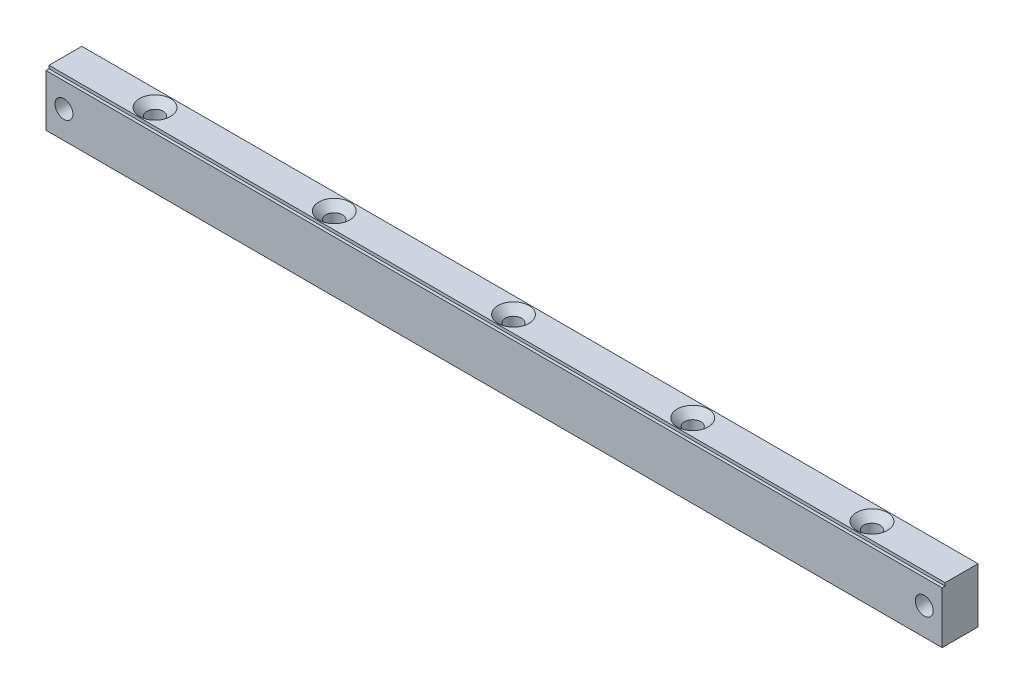
ISO-10303-21;
HEADER;
FILE_DESCRIPTION(('STEP AP214'),'2;1');
FILE_NAME('part.step','',(''),(''),'','','');
FILE_SCHEMA(('AUTOMOTIVE_DESIGN { 1 0 10303 214 1 1 1 1 }'));
ENDSEC;
DATA;
#1=APPLICATION_CONTEXT('core data for automotive mechanical design processes');
#2=APPLICATION_PROTOCOL_DEFINITION('international standard','automotive_design',2000,#1);
#3=PRODUCT_CONTEXT('',#1,'mechanical');
#4=PRODUCT('Part','Part','',(#3));
#5=PRODUCT_RELATED_PRODUCT_CATEGORY('part','',(#4));
#6=PRODUCT_DEFINITION_FORMATION('','',#4);
#7=PRODUCT_DEFINITION_CONTEXT('part definition',#1,'design');
#8=PRODUCT_DEFINITION('design','',#6,#7);
#9=PRODUCT_DEFINITION_SHAPE('','',#8);
#10=(LENGTH_UNIT() NAMED_UNIT(*) SI_UNIT(.MILLI.,.METRE.));
#11=(NAMED_UNIT(*) PLANE_ANGLE_UNIT() SI_UNIT($,.RADIAN.));
#12=(NAMED_UNIT(*) SI_UNIT($,.STERADIAN.) SOLID_ANGLE_UNIT());
#13=UNCERTAINTY_MEASURE_WITH_UNIT(LENGTH_MEASURE(1.E-05),#10,'distance_accuracy_value','');
#14=(GEOMETRIC_REPRESENTATION_CONTEXT(3) GLOBAL_UNCERTAINTY_ASSIGNED_CONTEXT((#13)) GLOBAL_UNIT_ASSIGNED_CONTEXT((#10,
#11,#12)) REPRESENTATION_CONTEXT('',''));
#15=CARTESIAN_POINT('',(0.,0.,0.));
#16=DIRECTION('',(0.,0.,1.));
#17=DIRECTION('',(1.,0.,0.));
#18=AXIS2_PLACEMENT_3D('',#15,#16,#17);
#19=CARTESIAN_POINT('',(-150.,18.35,-12.));
#20=DIRECTION('',(1.,0.,0.));
#21=DIRECTION('',(0.,0.,-1.));
#22=AXIS2_PLACEMENT_3D('',#19,#20,#21);
#23=PLANE('',#22);
#24=DIRECTION('',(0.,0.,1.));
#25=VECTOR('',#24,1.);
#26=CARTESIAN_POINT('',(-150.,17.35,0.));
#27=LINE('',#26,#25);
#28=CARTESIAN_POINT('',(-150.,17.35,-1.00000000000003));
#29=VERTEX_POINT('',#28);
#30=CARTESIAN_POINT('',(-150.,17.35,0.));
#31=VERTEX_POINT('',#30);
#32=EDGE_CURVE('E138',#29,#31,#27,.T.);
#33=ORIENTED_EDGE('',*,*,#32,.F.);
#34=DIRECTION('',(0.,1.,0.));
#35=VECTOR('',#34,1.);
#36=CARTESIAN_POINT('',(-150.,17.35,-1.00000000000003));
#37=LINE('',#36,#35);
#38=CARTESIAN_POINT('',(-150.,18.35,-1.00000000000003));
#39=VERTEX_POINT('',#38);
#40=EDGE_CURVE('E110',#29,#39,#37,.T.);
#41=ORIENTED_EDGE('',*,*,#40,.T.);
#42=DIRECTION('',(0.,0.,1.));
#43=VECTOR('',#42,1.);
#44=CARTESIAN_POINT('',(-150.,18.35,-12.));
#45=LINE('',#44,#43);
#46=CARTESIAN_POINT('',(-150.,18.35,-12.));
#47=VERTEX_POINT('',#46);
#48=EDGE_CURVE('E94',#47,#39,#45,.T.);
#49=ORIENTED_EDGE('',*,*,#48,.F.);
#50=DIRECTION('',(0.,-1.,0.));
#51=VECTOR('',#50,1.);
#52=CARTESIAN_POINT('',(-150.,18.35,-12.));
#53=LINE('',#52,#51);
#54=CARTESIAN_POINT('',(-150.,0.,-12.));
#55=VERTEX_POINT('',#54);
#56=EDGE_CURVE('E86',#47,#55,#53,.T.);
#57=ORIENTED_EDGE('',*,*,#56,.T.);
#58=DIRECTION('',(0.,0.,1.));
#59=VECTOR('',#58,1.);
#60=CARTESIAN_POINT('',(-150.,0.,-12.));
#61=LINE('',#60,#59);
#62=CARTESIAN_POINT('',(-150.,0.,0.));
#63=VERTEX_POINT('',#62);
#64=EDGE_CURVE('E101',#55,#63,#61,.T.);
#65=ORIENTED_EDGE('',*,*,#64,.T.);
#66=DIRECTION('',(0.,-1.,0.));
#67=VECTOR('',#66,1.);
#68=CARTESIAN_POINT('',(-150.,18.35,0.));
#69=LINE('',#68,#67);
#70=EDGE_CURVE('E11',#31,#63,#69,.T.);
#71=ORIENTED_EDGE('',*,*,#70,.F.);
#72=EDGE_LOOP('',(#33,#41,#49,#57,#65,#71));
#73=FACE_BOUND('',#72,.T.);
#74=ADVANCED_FACE('F41',(#73),#23,.F.);
#75=CARTESIAN_POINT('',(-150.,18.35,0.));
#76=DIRECTION('',(0.,0.,-1.));
#77=DIRECTION('',(-1.,0.,0.));
#78=AXIS2_PLACEMENT_3D('',#75,#76,#77);
#79=PLANE('',#78);
#80=CARTESIAN_POINT('',(-144.,9.175,0.));
#81=DIRECTION('',(0.,0.,1.));
#82=DIRECTION('',(1.,0.,0.));
#83=AXIS2_PLACEMENT_3D('',#80,#81,#82);
#84=CIRCLE('',#83,2.99999999999999);
#85=CARTESIAN_POINT('',(-141.,9.175,0.));
#86=VERTEX_POINT('',#85);
#87=EDGE_CURVE('E194',#86,#86,#84,.T.);
#88=ORIENTED_EDGE('',*,*,#87,.F.);
#89=EDGE_LOOP('',(#88));
#90=FACE_BOUND('',#89,.T.);
#91=CARTESIAN_POINT('',(144.,9.17500000000004,0.));
#92=DIRECTION('',(0.,0.,1.));
#93=DIRECTION('',(1.,0.,0.));
#94=AXIS2_PLACEMENT_3D('',#91,#92,#93);
#95=CIRCLE('',#94,2.99999999999999);
#96=CARTESIAN_POINT('',(147.,9.17500000000004,0.));
#97=VERTEX_POINT('',#96);
#98=EDGE_CURVE('E197',#97,#97,#95,.T.);
#99=ORIENTED_EDGE('',*,*,#98,.F.);
#100=EDGE_LOOP('',(#99));
#101=FACE_BOUND('',#100,.T.);
#102=DIRECTION('',(0.,-1.,0.));
#103=VECTOR('',#102,1.);
#104=CARTESIAN_POINT('',(150.,18.35,0.));
#105=LINE('',#104,#103);
#106=CARTESIAN_POINT('',(150.,17.35,0.));
#107=VERTEX_POINT('',#106);
#108=CARTESIAN_POINT('',(150.,0.,0.));
#109=VERTEX_POINT('',#108);
#110=EDGE_CURVE('E49',#107,#109,#105,.T.);
#111=ORIENTED_EDGE('',*,*,#110,.F.);
#112=DIRECTION('',(1.,0.,0.));
#113=VECTOR('',#112,1.);
#114=CARTESIAN_POINT('',(-150.,17.35,0.));
#115=LINE('',#114,#113);
#116=EDGE_CURVE('E136',#31,#107,#115,.T.);
#117=ORIENTED_EDGE('',*,*,#116,.F.);
#118=ORIENTED_EDGE('',*,*,#70,.T.);
#119=DIRECTION('',(1.,0.,0.));
#120=VECTOR('',#119,1.);
#121=CARTESIAN_POINT('',(-150.,0.,0.));
#122=LINE('',#121,#120);
#123=EDGE_CURVE('E108',#63,#109,#122,.T.);
#124=ORIENTED_EDGE('',*,*,#123,.T.);
#125=EDGE_LOOP('',(#111,#117,#118,#124));
#126=FACE_BOUND('',#125,.T.);
#127=ADVANCED_FACE('F133',(#90,#101,#126),#79,.F.);
#128=CARTESIAN_POINT('',(150.,18.35,-12.0000000000001));
#129=DIRECTION('',(-1.,0.,0.));
#130=DIRECTION('',(0.,0.,1.));
#131=AXIS2_PLACEMENT_3D('',#128,#129,#130);
#132=PLANE('',#131);
#133=DIRECTION('',(0.,0.,-1.));
#134=VECTOR('',#133,1.);
#135=CARTESIAN_POINT('',(150.,18.35,-12.0000000000001));
#136=LINE('',#135,#134);
#137=CARTESIAN_POINT('',(150.,18.35,-1.00000000000003));
#138=VERTEX_POINT('',#137);
#139=CARTESIAN_POINT('',(150.,18.35,-12.0000000000001));
#140=VERTEX_POINT('',#139);
#141=EDGE_CURVE('E164',#138,#140,#136,.T.);
#142=ORIENTED_EDGE('',*,*,#141,.F.);
#143=DIRECTION('',(0.,1.,0.));
#144=VECTOR('',#143,1.);
#145=CARTESIAN_POINT('',(150.,17.35,-1.00000000000003));
#146=LINE('',#145,#144);
#147=CARTESIAN_POINT('',(150.,17.35,-1.00000000000003));
#148=VERTEX_POINT('',#147);
#149=EDGE_CURVE('E56',#148,#138,#146,.T.);
#150=ORIENTED_EDGE('',*,*,#149,.F.);
#151=DIRECTION('',(0.,0.,-1.));
#152=VECTOR('',#151,1.);
#153=CARTESIAN_POINT('',(150.,17.35,0.));
#154=LINE('',#153,#152);
#155=EDGE_CURVE('E130',#107,#148,#154,.T.);
#156=ORIENTED_EDGE('',*,*,#155,.F.);
#157=ORIENTED_EDGE('',*,*,#110,.T.);
#158=DIRECTION('',(0.,0.,-1.));
#159=VECTOR('',#158,1.);
#160=CARTESIAN_POINT('',(150.,0.,-12.0000000000001));
#161=LINE('',#160,#159);
#162=CARTESIAN_POINT('',(150.,0.,-12.0000000000001));
#163=VERTEX_POINT('',#162);
#164=EDGE_CURVE('E95',#109,#163,#161,.T.);
#165=ORIENTED_EDGE('',*,*,#164,.T.);
#166=DIRECTION('',(0.,-1.,0.));
#167=VECTOR('',#166,1.);
#168=CARTESIAN_POINT('',(150.,18.35,-12.0000000000001));
#169=LINE('',#168,#167);
#170=EDGE_CURVE('E89',#140,#163,#169,.T.);
#171=ORIENTED_EDGE('',*,*,#170,.F.);
#172=EDGE_LOOP('',(#142,#150,#156,#157,#165,#171));
#173=FACE_BOUND('',#172,.T.);
#174=ADVANCED_FACE('F127',(#173),#132,.F.);
#175=CARTESIAN_POINT('',(-150.,18.35,-12.));
#176=DIRECTION('',(0.,0.,1.));
#177=DIRECTION('',(1.,0.,0.));
#178=AXIS2_PLACEMENT_3D('',#175,#176,#177);
#179=PLANE('',#178);
#180=CARTESIAN_POINT('',(-144.,9.175,-12.));
#181=DIRECTION('',(0.,0.,1.));
#182=DIRECTION('',(1.,0.,0.));
#183=AXIS2_PLACEMENT_3D('',#180,#181,#182);
#184=CIRCLE('',#183,2.99999999999999);
#185=CARTESIAN_POINT('',(-141.,9.175,-12.));
#186=VERTEX_POINT('',#185);
#187=EDGE_CURVE('E200',#186,#186,#184,.T.);
#188=ORIENTED_EDGE('',*,*,#187,.T.);
#189=EDGE_LOOP('',(#188));
#190=FACE_BOUND('',#189,.T.);
#191=CARTESIAN_POINT('',(144.,9.17500000000004,-12.));
#192=DIRECTION('',(0.,0.,1.));
#193=DIRECTION('',(1.,0.,0.));
#194=AXIS2_PLACEMENT_3D('',#191,#192,#193);
#195=CIRCLE('',#194,2.99999999999999);
#196=CARTESIAN_POINT('',(147.,9.17500000000004,-12.));
#197=VERTEX_POINT('',#196);
#198=EDGE_CURVE('E201',#197,#197,#195,.T.);
#199=ORIENTED_EDGE('',*,*,#198,.T.);
#200=EDGE_LOOP('',(#199));
#201=FACE_BOUND('',#200,.T.);
#202=DIRECTION('',(-1.,0.,0.));
#203=VECTOR('',#202,1.);
#204=CARTESIAN_POINT('',(-150.,0.,-12.));
#205=LINE('',#204,#203);
#206=EDGE_CURVE('E83',#163,#55,#205,.T.);
#207=ORIENTED_EDGE('',*,*,#206,.T.);
#208=ORIENTED_EDGE('',*,*,#56,.F.);
#209=DIRECTION('',(-1.,0.,0.));
#210=VECTOR('',#209,1.);
#211=CARTESIAN_POINT('',(-150.,18.35,-12.));
#212=LINE('',#211,#210);
#213=EDGE_CURVE('E65',#140,#47,#212,.T.);
#214=ORIENTED_EDGE('',*,*,#213,.F.);
#215=ORIENTED_EDGE('',*,*,#170,.T.);
#216=EDGE_LOOP('',(#207,#208,#214,#215));
#217=FACE_BOUND('',#216,.T.);
#218=ADVANCED_FACE('F85',(#190,#201,#217),#179,.F.);
#219=CARTESIAN_POINT('',(0.,18.35,0.));
#220=DIRECTION('',(0.,1.,0.));
#221=DIRECTION('',(0.,0.,1.));
#222=AXIS2_PLACEMENT_3D('',#219,#220,#221);
#223=PLANE('',#222);
#224=CARTESIAN_POINT('',(-120.,18.35,-6.50000000000005));
#225=DIRECTION('',(0.,1.,0.));
#226=DIRECTION('',(0.,0.,1.));
#227=AXIS2_PLACEMENT_3D('',#224,#225,#226);
#228=CIRCLE('',#227,5.2);
#229=CARTESIAN_POINT('',(-120.,18.35,-1.30000000000006));
#230=VERTEX_POINT('',#229);
#231=EDGE_CURVE('E211',#230,#230,#228,.T.);
#232=ORIENTED_EDGE('',*,*,#231,.F.);
#233=EDGE_LOOP('',(#232));
#234=FACE_BOUND('',#233,.T.);
#235=CARTESIAN_POINT('',(-60.,18.35,-6.50000000000005));
#236=DIRECTION('',(0.,1.,0.));
#237=DIRECTION('',(0.,0.,1.));
#238=AXIS2_PLACEMENT_3D('',#235,#236,#237);
#239=CIRCLE('',#238,5.2);
#240=CARTESIAN_POINT('',(-60.,18.35,-1.30000000000005));
#241=VERTEX_POINT('',#240);
#242=EDGE_CURVE('E223',#241,#241,#239,.T.);
#243=ORIENTED_EDGE('',*,*,#242,.F.);
#244=EDGE_LOOP('',(#243));
#245=FACE_BOUND('',#244,.T.);
#246=CARTESIAN_POINT('',(120.,18.35,-6.50000000000006));
#247=DIRECTION('',(0.,1.,0.));
#248=DIRECTION('',(0.,0.,1.));
#249=AXIS2_PLACEMENT_3D('',#246,#247,#248);
#250=CIRCLE('',#249,5.2);
#251=CARTESIAN_POINT('',(120.,18.35,-1.30000000000006));
#252=VERTEX_POINT('',#251);
#253=EDGE_CURVE('E235',#252,#252,#250,.T.);
#254=ORIENTED_EDGE('',*,*,#253,.F.);
#255=EDGE_LOOP('',(#254));
#256=FACE_BOUND('',#255,.T.);
#257=CARTESIAN_POINT('',(60.,18.35,-6.50000000000006));
#258=DIRECTION('',(0.,1.,0.));
#259=DIRECTION('',(0.,0.,1.));
#260=AXIS2_PLACEMENT_3D('',#257,#258,#259);
#261=CIRCLE('',#260,5.2);
#262=CARTESIAN_POINT('',(60.,18.35,-1.30000000000005));
#263=VERTEX_POINT('',#262);
#264=EDGE_CURVE('E247',#263,#263,#261,.T.);
#265=ORIENTED_EDGE('',*,*,#264,.F.);
#266=EDGE_LOOP('',(#265));
#267=FACE_BOUND('',#266,.T.);
#268=CARTESIAN_POINT('',(0.,18.35,-6.50000000000006));
#269=DIRECTION('',(0.,1.,0.));
#270=DIRECTION('',(0.,0.,1.));
#271=AXIS2_PLACEMENT_3D('',#268,#269,#270);
#272=CIRCLE('',#271,5.2);
#273=CARTESIAN_POINT('',(0.,18.35,-1.30000000000005));
#274=VERTEX_POINT('',#273);
#275=EDGE_CURVE('E259',#274,#274,#272,.T.);
#276=ORIENTED_EDGE('',*,*,#275,.F.);
#277=EDGE_LOOP('',(#276));
#278=FACE_BOUND('',#277,.T.);
#279=DIRECTION('',(-1.,0.,0.));
#280=VECTOR('',#279,1.);
#281=CARTESIAN_POINT('',(-150.,18.35,-1.00000000000003));
#282=LINE('',#281,#280);
#283=EDGE_CURVE('E150',#138,#39,#282,.T.);
#284=ORIENTED_EDGE('',*,*,#283,.F.);
#285=ORIENTED_EDGE('',*,*,#141,.T.);
#286=ORIENTED_EDGE('',*,*,#213,.T.);
#287=ORIENTED_EDGE('',*,*,#48,.T.);
#288=EDGE_LOOP('',(#284,#285,#286,#287));
#289=FACE_BOUND('',#288,.T.);
#290=ADVANCED_FACE('F167',(#234,#245,#256,#267,#278,#289),#223,.T.);
#291=CARTESIAN_POINT('',(0.,0.,0.));
#292=DIRECTION('',(0.,1.,0.));
#293=DIRECTION('',(0.,0.,1.));
#294=AXIS2_PLACEMENT_3D('',#291,#292,#293);
#295=PLANE('',#294);
#296=CARTESIAN_POINT('',(-120.,0.,-6.50000000000005));
#297=DIRECTION('',(0.,1.,0.));
#298=DIRECTION('',(0.,0.,1.));
#299=AXIS2_PLACEMENT_3D('',#296,#297,#298);
#300=CIRCLE('',#299,2.74999999999999);
#301=CARTESIAN_POINT('',(-120.,0.,-3.75000000000007));
#302=VERTEX_POINT('',#301);
#303=EDGE_CURVE('E219',#302,#302,#300,.T.);
#304=ORIENTED_EDGE('',*,*,#303,.T.);
#305=EDGE_LOOP('',(#304));
#306=FACE_BOUND('',#305,.T.);
#307=CARTESIAN_POINT('',(-60.,0.,-6.50000000000005));
#308=DIRECTION('',(0.,1.,0.));
#309=DIRECTION('',(0.,0.,1.));
#310=AXIS2_PLACEMENT_3D('',#307,#308,#309);
#311=CIRCLE('',#310,2.75);
#312=CARTESIAN_POINT('',(-60.,0.,-3.75000000000006));
#313=VERTEX_POINT('',#312);
#314=EDGE_CURVE('E231',#313,#313,#311,.T.);
#315=ORIENTED_EDGE('',*,*,#314,.T.);
#316=EDGE_LOOP('',(#315));
#317=FACE_BOUND('',#316,.T.);
#318=CARTESIAN_POINT('',(120.,0.,-6.50000000000006));
#319=DIRECTION('',(0.,1.,0.));
#320=DIRECTION('',(0.,0.,1.));
#321=AXIS2_PLACEMENT_3D('',#318,#319,#320);
#322=CIRCLE('',#321,2.74999999999999);
#323=CARTESIAN_POINT('',(120.,0.,-3.75000000000007));
#324=VERTEX_POINT('',#323);
#325=EDGE_CURVE('E243',#324,#324,#322,.T.);
#326=ORIENTED_EDGE('',*,*,#325,.T.);
#327=EDGE_LOOP('',(#326));
#328=FACE_BOUND('',#327,.T.);
#329=CARTESIAN_POINT('',(60.,0.,-6.50000000000006));
#330=DIRECTION('',(0.,1.,0.));
#331=DIRECTION('',(0.,0.,1.));
#332=AXIS2_PLACEMENT_3D('',#329,#330,#331);
#333=CIRCLE('',#332,2.75);
#334=CARTESIAN_POINT('',(60.,0.,-3.75000000000006));
#335=VERTEX_POINT('',#334);
#336=EDGE_CURVE('E255',#335,#335,#333,.T.);
#337=ORIENTED_EDGE('',*,*,#336,.T.);
#338=EDGE_LOOP('',(#337));
#339=FACE_BOUND('',#338,.T.);
#340=CARTESIAN_POINT('',(0.,0.,-6.50000000000006));
#341=DIRECTION('',(0.,1.,0.));
#342=DIRECTION('',(0.,0.,1.));
#343=AXIS2_PLACEMENT_3D('',#340,#341,#342);
#344=CIRCLE('',#343,2.75);
#345=CARTESIAN_POINT('',(0.,0.,-3.75000000000006));
#346=VERTEX_POINT('',#345);
#347=EDGE_CURVE('E161',#346,#346,#344,.T.);
#348=ORIENTED_EDGE('',*,*,#347,.T.);
#349=EDGE_LOOP('',(#348));
#350=FACE_BOUND('',#349,.T.);
#351=ORIENTED_EDGE('',*,*,#64,.F.);
#352=ORIENTED_EDGE('',*,*,#206,.F.);
#353=ORIENTED_EDGE('',*,*,#164,.F.);
#354=ORIENTED_EDGE('',*,*,#123,.F.);
#355=EDGE_LOOP('',(#351,#352,#353,#354));
#356=FACE_BOUND('',#355,.T.);
#357=ADVANCED_FACE('F106',(#306,#317,#328,#339,#350,#356),#295,.F.);
#358=CARTESIAN_POINT('',(-150.,17.35,-1.00000000000003));
#359=DIRECTION('',(0.,0.,-1.));
#360=DIRECTION('',(-1.,0.,0.));
#361=AXIS2_PLACEMENT_3D('',#358,#359,#360);
#362=PLANE('',#361);
#363=ORIENTED_EDGE('',*,*,#283,.T.);
#364=ORIENTED_EDGE('',*,*,#40,.F.);
#365=DIRECTION('',(-1.,0.,0.));
#366=VECTOR('',#365,1.);
#367=CARTESIAN_POINT('',(-150.,17.35,-1.00000000000003));
#368=LINE('',#367,#366);
#369=EDGE_CURVE('E149',#148,#29,#368,.T.);
#370=ORIENTED_EDGE('',*,*,#369,.F.);
#371=ORIENTED_EDGE('',*,*,#149,.T.);
#372=EDGE_LOOP('',(#363,#364,#370,#371));
#373=FACE_BOUND('',#372,.T.);
#374=ADVANCED_FACE('F148',(#373),#362,.F.);
#375=CARTESIAN_POINT('',(0.,17.35,0.));
#376=DIRECTION('',(0.,-1.,0.));
#377=DIRECTION('',(0.,0.,-1.));
#378=AXIS2_PLACEMENT_3D('',#375,#376,#377);
#379=PLANE('',#378);
#380=ORIENTED_EDGE('',*,*,#32,.T.);
#381=ORIENTED_EDGE('',*,*,#116,.T.);
#382=ORIENTED_EDGE('',*,*,#155,.T.);
#383=ORIENTED_EDGE('',*,*,#369,.T.);
#384=EDGE_LOOP('',(#380,#381,#382,#383));
#385=FACE_BOUND('',#384,.T.);
#386=ADVANCED_FACE('F151',(#385),#379,.F.);
#387=CARTESIAN_POINT('',(0.,18.35,-6.50000000000006));
#388=DIRECTION('',(0.,1.,0.));
#389=DIRECTION('',(0.,0.,1.));
#390=AXIS2_PLACEMENT_3D('',#387,#388,#389);
#391=CYLINDRICAL_SURFACE('',#390,2.75);
#392=ORIENTED_EDGE('',*,*,#347,.F.);
#393=EDGE_LOOP('',(#392));
#394=FACE_BOUND('',#393,.T.);
#395=CARTESIAN_POINT('',(0.,15.9,-6.50000000000006));
#396=DIRECTION('',(0.,1.,0.));
#397=DIRECTION('',(0.,0.,1.));
#398=AXIS2_PLACEMENT_3D('',#395,#396,#397);
#399=CIRCLE('',#398,2.75);
#400=CARTESIAN_POINT('',(0.,15.9,-3.75000000000006));
#401=VERTEX_POINT('',#400);
#402=EDGE_CURVE('E263',#401,#401,#399,.T.);
#403=ORIENTED_EDGE('',*,*,#402,.T.);
#404=EDGE_LOOP('',(#403));
#405=FACE_BOUND('',#404,.T.);
#406=ADVANCED_FACE('F323',(#394,#405),#391,.F.);
#407=CARTESIAN_POINT('',(0.,18.35,-6.50000000000006));
#408=DIRECTION('',(0.,1.,0.));
#409=DIRECTION('',(0.,0.,1.));
#410=AXIS2_PLACEMENT_3D('',#407,#408,#409);
#411=CONICAL_SURFACE('',#410,5.2,0.785398163397448);
#412=ORIENTED_EDGE('',*,*,#402,.F.);
#413=EDGE_LOOP('',(#412));
#414=FACE_BOUND('',#413,.T.);
#415=ORIENTED_EDGE('',*,*,#275,.T.);
#416=EDGE_LOOP('',(#415));
#417=FACE_BOUND('',#416,.T.);
#418=ADVANCED_FACE('F319',(#414,#417),#411,.F.);
#419=CARTESIAN_POINT('',(60.,18.35,-6.50000000000006));
#420=DIRECTION('',(0.,1.,0.));
#421=DIRECTION('',(0.,0.,1.));
#422=AXIS2_PLACEMENT_3D('',#419,#420,#421);
#423=CYLINDRICAL_SURFACE('',#422,2.75);
#424=ORIENTED_EDGE('',*,*,#336,.F.);
#425=EDGE_LOOP('',(#424));
#426=FACE_BOUND('',#425,.T.);
#427=CARTESIAN_POINT('',(60.,15.9,-6.50000000000006));
#428=DIRECTION('',(0.,1.,0.));
#429=DIRECTION('',(0.,0.,1.));
#430=AXIS2_PLACEMENT_3D('',#427,#428,#429);
#431=CIRCLE('',#430,2.75);
#432=CARTESIAN_POINT('',(60.,15.9,-3.75000000000006));
#433=VERTEX_POINT('',#432);
#434=EDGE_CURVE('E251',#433,#433,#431,.T.);
#435=ORIENTED_EDGE('',*,*,#434,.T.);
#436=EDGE_LOOP('',(#435));
#437=FACE_BOUND('',#436,.T.);
#438=ADVANCED_FACE('F315',(#426,#437),#423,.F.);
#439=CARTESIAN_POINT('',(60.,18.35,-6.50000000000006));
#440=DIRECTION('',(0.,1.,0.));
#441=DIRECTION('',(0.,0.,1.));
#442=AXIS2_PLACEMENT_3D('',#439,#440,#441);
#443=CONICAL_SURFACE('',#442,5.2,0.785398163397449);
#444=ORIENTED_EDGE('',*,*,#434,.F.);
#445=EDGE_LOOP('',(#444));
#446=FACE_BOUND('',#445,.T.);
#447=ORIENTED_EDGE('',*,*,#264,.T.);
#448=EDGE_LOOP('',(#447));
#449=FACE_BOUND('',#448,.T.);
#450=ADVANCED_FACE('F311',(#446,#449),#443,.F.);
#451=CARTESIAN_POINT('',(120.,18.35,-6.50000000000006));
#452=DIRECTION('',(0.,1.,0.));
#453=DIRECTION('',(0.,0.,1.));
#454=AXIS2_PLACEMENT_3D('',#451,#452,#453);
#455=CYLINDRICAL_SURFACE('',#454,2.75);
#456=ORIENTED_EDGE('',*,*,#325,.F.);
#457=EDGE_LOOP('',(#456));
#458=FACE_BOUND('',#457,.T.);
#459=CARTESIAN_POINT('',(120.,15.9,-6.50000000000006));
#460=DIRECTION('',(0.,1.,0.));
#461=DIRECTION('',(0.,0.,1.));
#462=AXIS2_PLACEMENT_3D('',#459,#460,#461);
#463=CIRCLE('',#462,2.75);
#464=CARTESIAN_POINT('',(120.,15.9,-3.75000000000005));
#465=VERTEX_POINT('',#464);
#466=EDGE_CURVE('E239',#465,#465,#463,.T.);
#467=ORIENTED_EDGE('',*,*,#466,.T.);
#468=EDGE_LOOP('',(#467));
#469=FACE_BOUND('',#468,.T.);
#470=ADVANCED_FACE('F307',(#458,#469),#455,.F.);
#471=CARTESIAN_POINT('',(120.,18.35,-6.50000000000006));
#472=DIRECTION('',(0.,1.,0.));
#473=DIRECTION('',(0.,0.,1.));
#474=AXIS2_PLACEMENT_3D('',#471,#472,#473);
#475=CONICAL_SURFACE('',#474,5.2,0.785398163397446);
#476=ORIENTED_EDGE('',*,*,#466,.F.);
#477=EDGE_LOOP('',(#476));
#478=FACE_BOUND('',#477,.T.);
#479=ORIENTED_EDGE('',*,*,#253,.T.);
#480=EDGE_LOOP('',(#479));
#481=FACE_BOUND('',#480,.T.);
#482=ADVANCED_FACE('F303',(#478,#481),#475,.F.);
#483=CARTESIAN_POINT('',(-60.,18.35,-6.50000000000005));
#484=DIRECTION('',(0.,1.,0.));
#485=DIRECTION('',(0.,0.,1.));
#486=AXIS2_PLACEMENT_3D('',#483,#484,#485);
#487=CYLINDRICAL_SURFACE('',#486,2.75);
#488=ORIENTED_EDGE('',*,*,#314,.F.);
#489=EDGE_LOOP('',(#488));
#490=FACE_BOUND('',#489,.T.);
#491=CARTESIAN_POINT('',(-60.,15.9,-6.50000000000005));
#492=DIRECTION('',(0.,1.,0.));
#493=DIRECTION('',(0.,0.,1.));
#494=AXIS2_PLACEMENT_3D('',#491,#492,#493);
#495=CIRCLE('',#494,2.75);
#496=CARTESIAN_POINT('',(-60.,15.9,-3.75000000000006));
#497=VERTEX_POINT('',#496);
#498=EDGE_CURVE('E227',#497,#497,#495,.T.);
#499=ORIENTED_EDGE('',*,*,#498,.T.);
#500=EDGE_LOOP('',(#499));
#501=FACE_BOUND('',#500,.T.);
#502=ADVANCED_FACE('F299',(#490,#501),#487,.F.);
#503=CARTESIAN_POINT('',(-60.,18.35,-6.50000000000005));
#504=DIRECTION('',(0.,1.,0.));
#505=DIRECTION('',(0.,0.,1.));
#506=AXIS2_PLACEMENT_3D('',#503,#504,#505);
#507=CONICAL_SURFACE('',#506,5.2,0.785398163397449);
#508=ORIENTED_EDGE('',*,*,#498,.F.);
#509=EDGE_LOOP('',(#508));
#510=FACE_BOUND('',#509,.T.);
#511=ORIENTED_EDGE('',*,*,#242,.T.);
#512=EDGE_LOOP('',(#511));
#513=FACE_BOUND('',#512,.T.);
#514=ADVANCED_FACE('F295',(#510,#513),#507,.F.);
#515=CARTESIAN_POINT('',(-120.,18.35,-6.50000000000005));
#516=DIRECTION('',(0.,1.,0.));
#517=DIRECTION('',(0.,0.,1.));
#518=AXIS2_PLACEMENT_3D('',#515,#516,#517);
#519=CYLINDRICAL_SURFACE('',#518,2.75);
#520=ORIENTED_EDGE('',*,*,#303,.F.);
#521=EDGE_LOOP('',(#520));
#522=FACE_BOUND('',#521,.T.);
#523=CARTESIAN_POINT('',(-120.,15.9,-6.50000000000005));
#524=DIRECTION('',(0.,1.,0.));
#525=DIRECTION('',(0.,0.,1.));
#526=AXIS2_PLACEMENT_3D('',#523,#524,#525);
#527=CIRCLE('',#526,2.75);
#528=CARTESIAN_POINT('',(-120.,15.9,-3.75000000000005));
#529=VERTEX_POINT('',#528);
#530=EDGE_CURVE('E215',#529,#529,#527,.T.);
#531=ORIENTED_EDGE('',*,*,#530,.T.);
#532=EDGE_LOOP('',(#531));
#533=FACE_BOUND('',#532,.T.);
#534=ADVANCED_FACE('F289',(#522,#533),#519,.F.);
#535=CARTESIAN_POINT('',(-120.,18.35,-6.50000000000005));
#536=DIRECTION('',(0.,1.,0.));
#537=DIRECTION('',(0.,0.,1.));
#538=AXIS2_PLACEMENT_3D('',#535,#536,#537);
#539=CONICAL_SURFACE('',#538,5.2,0.785398163397446);
#540=ORIENTED_EDGE('',*,*,#530,.F.);
#541=EDGE_LOOP('',(#540));
#542=FACE_BOUND('',#541,.T.);
#543=ORIENTED_EDGE('',*,*,#231,.T.);
#544=EDGE_LOOP('',(#543));
#545=FACE_BOUND('',#544,.T.);
#546=ADVANCED_FACE('F284',(#542,#545),#539,.F.);
#547=CARTESIAN_POINT('',(144.,9.17500000000004,0.));
#548=DIRECTION('',(0.,0.,-1.));
#549=DIRECTION('',(-1.,0.,0.));
#550=AXIS2_PLACEMENT_3D('',#547,#548,#549);
#551=CYLINDRICAL_SURFACE('',#550,2.99999999999999);
#552=ORIENTED_EDGE('',*,*,#98,.T.);
#553=EDGE_LOOP('',(#552));
#554=FACE_BOUND('',#553,.T.);
#555=ORIENTED_EDGE('',*,*,#198,.F.);
#556=EDGE_LOOP('',(#555));
#557=FACE_BOUND('',#556,.T.);
#558=ADVANCED_FACE('F277',(#554,#557),#551,.F.);
#559=CARTESIAN_POINT('',(-144.,9.175,0.));
#560=DIRECTION('',(0.,0.,-1.));
#561=DIRECTION('',(-1.,0.,0.));
#562=AXIS2_PLACEMENT_3D('',#559,#560,#561);
#563=CYLINDRICAL_SURFACE('',#562,2.99999999999999);
#564=ORIENTED_EDGE('',*,*,#87,.T.);
#565=EDGE_LOOP('',(#564));
#566=FACE_BOUND('',#565,.T.);
#567=ORIENTED_EDGE('',*,*,#187,.F.);
#568=EDGE_LOOP('',(#567));
#569=FACE_BOUND('',#568,.T.);
#570=ADVANCED_FACE('F274',(#566,#569),#563,.F.);
#571=CLOSED_SHELL('',(#74,#127,#174,#218,#290,#357,#374,#386,#406,#418,#438,#450,#470,#482,#502,
#514,#534,#546,#558,#570));
#572=MANIFOLD_SOLID_BREP('B2',#571);
#573=ADVANCED_BREP_SHAPE_REPRESENTATION('',(#18,#572),#14);
#574=SHAPE_DEFINITION_REPRESENTATION(#9,#573);
ENDSEC;
END-ISO-10303-21;
